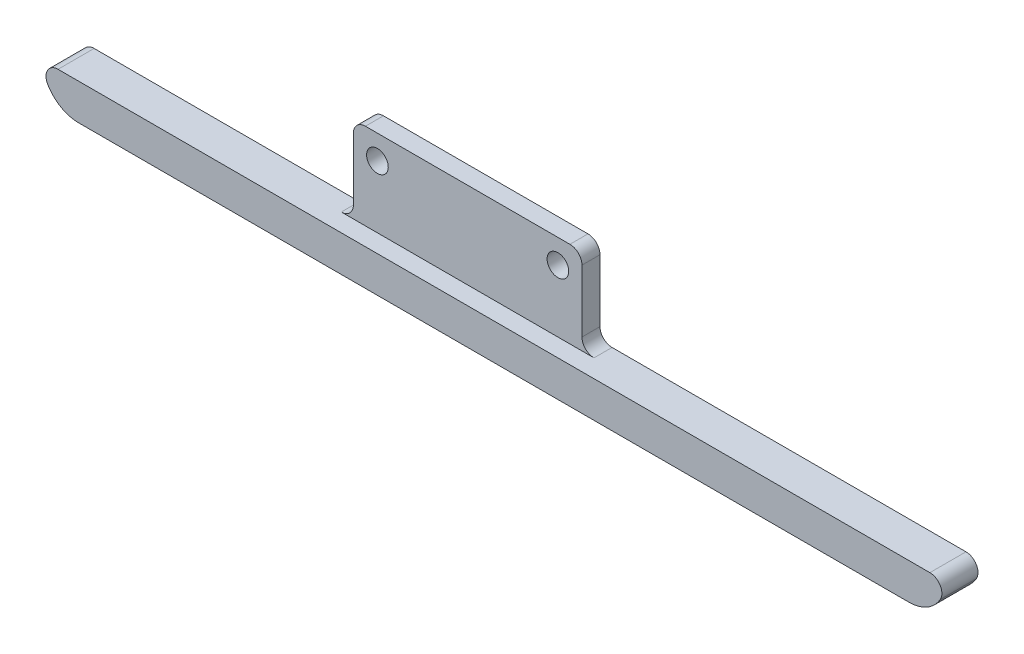
ISO-10303-21;
HEADER;
FILE_DESCRIPTION(('STEP AP214'),'2;1');
FILE_NAME('part.step','',(''),(''),'','','');
FILE_SCHEMA(('AUTOMOTIVE_DESIGN { 1 0 10303 214 1 1 1 1 }'));
ENDSEC;
DATA;
#1=APPLICATION_CONTEXT('core data for automotive mechanical design processes');
#2=APPLICATION_PROTOCOL_DEFINITION('international standard','automotive_design',2000,#1);
#3=PRODUCT_CONTEXT('',#1,'mechanical');
#4=PRODUCT('Part','Part','',(#3));
#5=PRODUCT_RELATED_PRODUCT_CATEGORY('part','',(#4));
#6=PRODUCT_DEFINITION_FORMATION('','',#4);
#7=PRODUCT_DEFINITION_CONTEXT('part definition',#1,'design');
#8=PRODUCT_DEFINITION('design','',#6,#7);
#9=PRODUCT_DEFINITION_SHAPE('','',#8);
#10=(LENGTH_UNIT() NAMED_UNIT(*) SI_UNIT(.MILLI.,.METRE.));
#11=(NAMED_UNIT(*) PLANE_ANGLE_UNIT() SI_UNIT($,.RADIAN.));
#12=(NAMED_UNIT(*) SI_UNIT($,.STERADIAN.) SOLID_ANGLE_UNIT());
#13=UNCERTAINTY_MEASURE_WITH_UNIT(LENGTH_MEASURE(1.E-05),#10,'distance_accuracy_value','');
#14=(GEOMETRIC_REPRESENTATION_CONTEXT(3) GLOBAL_UNCERTAINTY_ASSIGNED_CONTEXT((#13)) GLOBAL_UNIT_ASSIGNED_CONTEXT((#10,
#11,#12)) REPRESENTATION_CONTEXT('',''));
#15=CARTESIAN_POINT('',(0.,0.,0.));
#16=DIRECTION('',(0.,0.,1.));
#17=DIRECTION('',(1.,0.,0.));
#18=AXIS2_PLACEMENT_3D('',#15,#16,#17);
#19=CARTESIAN_POINT('',(0.,0.,6.));
#20=DIRECTION('',(0.,-1.,0.));
#21=DIRECTION('',(1.,0.,0.));
#22=AXIS2_PLACEMENT_3D('',#19,#20,#21);
#23=PLANE('',#22);
#24=DIRECTION('',(-1.,0.,0.));
#25=VECTOR('',#24,1.);
#26=CARTESIAN_POINT('',(0.,0.,0.));
#27=LINE('',#26,#25);
#28=CARTESIAN_POINT('',(144.,0.,0.));
#29=VERTEX_POINT('',#28);
#30=CARTESIAN_POINT('',(6.,0.,0.));
#31=VERTEX_POINT('',#30);
#32=EDGE_CURVE('E160',#29,#31,#27,.T.);
#33=ORIENTED_EDGE('',*,*,#32,.F.);
#34=DIRECTION('',(0.,0.,-1.));
#35=VECTOR('',#34,1.);
#36=CARTESIAN_POINT('',(144.,0.,6.));
#37=LINE('',#36,#35);
#38=CARTESIAN_POINT('',(144.,0.,6.));
#39=VERTEX_POINT('',#38);
#40=EDGE_CURVE('E172',#29,#39,#37,.F.);
#41=ORIENTED_EDGE('',*,*,#40,.T.);
#42=DIRECTION('',(-1.,0.,0.));
#43=VECTOR('',#42,1.);
#44=CARTESIAN_POINT('',(0.,0.,6.));
#45=LINE('',#44,#43);
#46=CARTESIAN_POINT('',(6.,0.,6.));
#47=VERTEX_POINT('',#46);
#48=EDGE_CURVE('E307',#39,#47,#45,.T.);
#49=ORIENTED_EDGE('',*,*,#48,.T.);
#50=DIRECTION('',(0.,0.,-1.));
#51=VECTOR('',#50,1.);
#52=CARTESIAN_POINT('',(6.,0.,6.));
#53=LINE('',#52,#51);
#54=EDGE_CURVE('E166',#47,#31,#53,.T.);
#55=ORIENTED_EDGE('',*,*,#54,.T.);
#56=EDGE_LOOP('',(#33,#41,#49,#55));
#57=FACE_BOUND('',#56,.T.);
#58=ADVANCED_FACE('F51',(#57),#23,.T.);
#59=CARTESIAN_POINT('',(0.,6.,6.));
#60=DIRECTION('',(0.,1.,0.));
#61=DIRECTION('',(0.,0.,1.));
#62=AXIS2_PLACEMENT_3D('',#59,#60,#61);
#63=PLANE('',#62);
#64=DIRECTION('',(1.,0.,0.));
#65=VECTOR('',#64,1.);
#66=CARTESIAN_POINT('',(0.,6.,6.));
#67=LINE('',#66,#65);
#68=CARTESIAN_POINT('',(2.53589838486225,6.,6.));
#69=VERTEX_POINT('',#68);
#70=CARTESIAN_POINT('',(147.464101615138,6.,6.));
#71=VERTEX_POINT('',#70);
#72=EDGE_CURVE('E310',#69,#71,#67,.T.);
#73=ORIENTED_EDGE('',*,*,#72,.T.);
#74=DIRECTION('',(0.,0.,-1.));
#75=VECTOR('',#74,1.);
#76=CARTESIAN_POINT('',(147.464101615138,6.,6.));
#77=LINE('',#76,#75);
#78=CARTESIAN_POINT('',(147.464101615138,6.,0.));
#79=VERTEX_POINT('',#78);
#80=EDGE_CURVE('E206',#71,#79,#77,.T.);
#81=ORIENTED_EDGE('',*,*,#80,.T.);
#82=DIRECTION('',(1.,0.,0.));
#83=VECTOR('',#82,1.);
#84=CARTESIAN_POINT('',(0.,6.,0.));
#85=LINE('',#84,#83);
#86=CARTESIAN_POINT('',(88.63,6.,0.));
#87=VERTEX_POINT('',#86);
#88=EDGE_CURVE('E176',#87,#79,#85,.T.);
#89=ORIENTED_EDGE('',*,*,#88,.F.);
#90=DIRECTION('',(0.,0.,-1.));
#91=VECTOR('',#90,1.);
#92=CARTESIAN_POINT('',(88.63,6.,3.));
#93=LINE('',#92,#91);
#94=CARTESIAN_POINT('',(88.63,6.,3.));
#95=VERTEX_POINT('',#94);
#96=EDGE_CURVE('E202',#87,#95,#93,.F.);
#97=ORIENTED_EDGE('',*,*,#96,.T.);
#98=DIRECTION('',(1.,0.,0.));
#99=VECTOR('',#98,1.);
#100=CARTESIAN_POINT('',(0.,6.,3.));
#101=LINE('',#100,#99);
#102=CARTESIAN_POINT('',(46.63,6.,3.));
#103=VERTEX_POINT('',#102);
#104=EDGE_CURVE('E177',#103,#95,#101,.T.);
#105=ORIENTED_EDGE('',*,*,#104,.F.);
#106=DIRECTION('',(0.,0.,-1.));
#107=VECTOR('',#106,1.);
#108=CARTESIAN_POINT('',(46.63,6.,0.));
#109=LINE('',#108,#107);
#110=CARTESIAN_POINT('',(46.63,6.,0.));
#111=VERTEX_POINT('',#110);
#112=EDGE_CURVE('E198',#103,#111,#109,.T.);
#113=ORIENTED_EDGE('',*,*,#112,.T.);
#114=CARTESIAN_POINT('',(2.53589838486225,6.,0.));
#115=VERTEX_POINT('',#114);
#116=EDGE_CURVE('E273',#115,#111,#85,.T.);
#117=ORIENTED_EDGE('',*,*,#116,.F.);
#118=DIRECTION('',(0.,0.,-1.));
#119=VECTOR('',#118,1.);
#120=CARTESIAN_POINT('',(2.53589838486225,6.,6.));
#121=LINE('',#120,#119);
#122=EDGE_CURVE('E195',#115,#69,#121,.F.);
#123=ORIENTED_EDGE('',*,*,#122,.T.);
#124=EDGE_LOOP('',(#73,#81,#89,#97,#105,#113,#117,#123));
#125=FACE_BOUND('',#124,.T.);
#126=ADVANCED_FACE('F326',(#125),#63,.T.);
#127=CARTESIAN_POINT('',(0.,0.,6.));
#128=DIRECTION('',(0.,0.,1.));
#129=DIRECTION('',(1.,0.,0.));
#130=AXIS2_PLACEMENT_3D('',#127,#128,#129);
#131=PLANE('',#130);
#132=CARTESIAN_POINT('',(144.,6.00000000000002,6.));
#133=DIRECTION('',(0.,0.,1.));
#134=DIRECTION('',(1.,0.,0.));
#135=AXIS2_PLACEMENT_3D('',#132,#133,#134);
#136=CIRCLE('',#135,6.);
#137=CARTESIAN_POINT('',(149.196152422707,3.,6.));
#138=VERTEX_POINT('',#137);
#139=EDGE_CURVE('E182',#39,#138,#136,.T.);
#140=ORIENTED_EDGE('',*,*,#139,.T.);
#141=CARTESIAN_POINT('',(147.464101615138,4.,6.));
#142=DIRECTION('',(0.,0.,1.));
#143=DIRECTION('',(1.,0.,0.));
#144=AXIS2_PLACEMENT_3D('',#141,#142,#143);
#145=CIRCLE('',#144,2.);
#146=EDGE_CURVE('E227',#138,#71,#145,.T.);
#147=ORIENTED_EDGE('',*,*,#146,.T.);
#148=ORIENTED_EDGE('',*,*,#72,.F.);
#149=CARTESIAN_POINT('',(2.53589838486225,4.,6.));
#150=DIRECTION('',(0.,0.,1.));
#151=DIRECTION('',(1.,0.,0.));
#152=AXIS2_PLACEMENT_3D('',#149,#150,#151);
#153=CIRCLE('',#152,2.);
#154=CARTESIAN_POINT('',(0.803847577293368,3.,6.));
#155=VERTEX_POINT('',#154);
#156=EDGE_CURVE('E224',#69,#155,#153,.T.);
#157=ORIENTED_EDGE('',*,*,#156,.T.);
#158=CARTESIAN_POINT('',(6.,6.,6.));
#159=DIRECTION('',(0.,0.,1.));
#160=DIRECTION('',(1.,0.,0.));
#161=AXIS2_PLACEMENT_3D('',#158,#159,#160);
#162=CIRCLE('',#161,6.);
#163=EDGE_CURVE('E184',#155,#47,#162,.T.);
#164=ORIENTED_EDGE('',*,*,#163,.T.);
#165=ORIENTED_EDGE('',*,*,#48,.F.);
#166=EDGE_LOOP('',(#140,#147,#148,#157,#164,#165));
#167=FACE_BOUND('',#166,.T.);
#168=ADVANCED_FACE('F329',(#167),#131,.T.);
#169=CARTESIAN_POINT('',(0.,0.,0.));
#170=DIRECTION('',(0.,0.,1.));
#171=DIRECTION('',(1.,0.,0.));
#172=AXIS2_PLACEMENT_3D('',#169,#170,#171);
#173=PLANE('',#172);
#174=CARTESIAN_POINT('',(52.63,16.35,0.));
#175=DIRECTION('',(0.,0.,1.));
#176=DIRECTION('',(1.,0.,0.));
#177=AXIS2_PLACEMENT_3D('',#174,#175,#176);
#178=CIRCLE('',#177,1.8);
#179=CARTESIAN_POINT('',(54.43,16.35,0.));
#180=VERTEX_POINT('',#179);
#181=EDGE_CURVE('E354',#180,#180,#178,.T.);
#182=ORIENTED_EDGE('',*,*,#181,.T.);
#183=EDGE_LOOP('',(#182));
#184=FACE_BOUND('',#183,.T.);
#185=CARTESIAN_POINT('',(82.63,16.35,0.));
#186=DIRECTION('',(0.,0.,1.));
#187=DIRECTION('',(1.,0.,0.));
#188=AXIS2_PLACEMENT_3D('',#185,#186,#187);
#189=CIRCLE('',#188,1.8);
#190=CARTESIAN_POINT('',(84.43,16.35,0.));
#191=VERTEX_POINT('',#190);
#192=EDGE_CURVE('E303',#191,#191,#189,.T.);
#193=ORIENTED_EDGE('',*,*,#192,.T.);
#194=EDGE_LOOP('',(#193));
#195=FACE_BOUND('',#194,.T.);
#196=ORIENTED_EDGE('',*,*,#88,.T.);
#197=CARTESIAN_POINT('',(147.464101615138,4.,0.));
#198=DIRECTION('',(0.,0.,1.));
#199=DIRECTION('',(1.,0.,0.));
#200=AXIS2_PLACEMENT_3D('',#197,#198,#199);
#201=CIRCLE('',#200,2.);
#202=CARTESIAN_POINT('',(149.196152422707,3.,0.));
#203=VERTEX_POINT('',#202);
#204=EDGE_CURVE('E161',#79,#203,#201,.F.);
#205=ORIENTED_EDGE('',*,*,#204,.T.);
#206=CARTESIAN_POINT('',(144.,6.00000000000002,0.));
#207=DIRECTION('',(0.,0.,1.));
#208=DIRECTION('',(1.,0.,0.));
#209=AXIS2_PLACEMENT_3D('',#206,#207,#208);
#210=CIRCLE('',#209,6.);
#211=EDGE_CURVE('E155',#203,#29,#210,.F.);
#212=ORIENTED_EDGE('',*,*,#211,.T.);
#213=ORIENTED_EDGE('',*,*,#32,.T.);
#214=CARTESIAN_POINT('',(6.,6.,0.));
#215=DIRECTION('',(0.,0.,1.));
#216=DIRECTION('',(1.,0.,0.));
#217=AXIS2_PLACEMENT_3D('',#214,#215,#216);
#218=CIRCLE('',#217,6.);
#219=CARTESIAN_POINT('',(0.803847577293368,3.,0.));
#220=VERTEX_POINT('',#219);
#221=EDGE_CURVE('E167',#31,#220,#218,.F.);
#222=ORIENTED_EDGE('',*,*,#221,.T.);
#223=CARTESIAN_POINT('',(2.53589838486225,4.,0.));
#224=DIRECTION('',(0.,0.,1.));
#225=DIRECTION('',(1.,0.,0.));
#226=AXIS2_PLACEMENT_3D('',#223,#224,#225);
#227=CIRCLE('',#226,2.);
#228=EDGE_CURVE('E210',#220,#115,#227,.F.);
#229=ORIENTED_EDGE('',*,*,#228,.T.);
#230=ORIENTED_EDGE('',*,*,#116,.T.);
#231=CARTESIAN_POINT('',(46.63,8.,0.));
#232=DIRECTION('',(0.,0.,1.));
#233=DIRECTION('',(1.,0.,0.));
#234=AXIS2_PLACEMENT_3D('',#231,#232,#233);
#235=CIRCLE('',#234,2.);
#236=CARTESIAN_POINT('',(48.63,8.,0.));
#237=VERTEX_POINT('',#236);
#238=EDGE_CURVE('E60',#111,#237,#235,.T.);
#239=ORIENTED_EDGE('',*,*,#238,.T.);
#240=DIRECTION('',(0.,1.,0.));
#241=VECTOR('',#240,1.);
#242=CARTESIAN_POINT('',(48.63,0.,0.));
#243=LINE('',#242,#241);
#244=CARTESIAN_POINT('',(48.63,18.35,0.));
#245=VERTEX_POINT('',#244);
#246=EDGE_CURVE('E271',#237,#245,#243,.T.);
#247=ORIENTED_EDGE('',*,*,#246,.T.);
#248=CARTESIAN_POINT('',(50.63,18.35,0.));
#249=DIRECTION('',(0.,0.,1.));
#250=DIRECTION('',(1.,0.,0.));
#251=AXIS2_PLACEMENT_3D('',#248,#249,#250);
#252=CIRCLE('',#251,2.);
#253=CARTESIAN_POINT('',(50.63,20.35,0.));
#254=VERTEX_POINT('',#253);
#255=EDGE_CURVE('E213',#245,#254,#252,.F.);
#256=ORIENTED_EDGE('',*,*,#255,.T.);
#257=DIRECTION('',(1.,0.,0.));
#258=VECTOR('',#257,1.);
#259=CARTESIAN_POINT('',(0.,20.35,0.));
#260=LINE('',#259,#258);
#261=CARTESIAN_POINT('',(84.63,20.35,0.));
#262=VERTEX_POINT('',#261);
#263=EDGE_CURVE('E283',#254,#262,#260,.T.);
#264=ORIENTED_EDGE('',*,*,#263,.T.);
#265=CARTESIAN_POINT('',(84.63,18.35,0.));
#266=DIRECTION('',(0.,0.,1.));
#267=DIRECTION('',(1.,0.,0.));
#268=AXIS2_PLACEMENT_3D('',#265,#266,#267);
#269=CIRCLE('',#268,2.);
#270=CARTESIAN_POINT('',(86.63,18.35,0.));
#271=VERTEX_POINT('',#270);
#272=EDGE_CURVE('E216',#262,#271,#269,.F.);
#273=ORIENTED_EDGE('',*,*,#272,.T.);
#274=DIRECTION('',(0.,-1.,0.));
#275=VECTOR('',#274,1.);
#276=CARTESIAN_POINT('',(86.63,0.,0.));
#277=LINE('',#276,#275);
#278=CARTESIAN_POINT('',(86.63,8.,0.));
#279=VERTEX_POINT('',#278);
#280=EDGE_CURVE('E299',#271,#279,#277,.T.);
#281=ORIENTED_EDGE('',*,*,#280,.T.);
#282=CARTESIAN_POINT('',(88.63,8.,0.));
#283=DIRECTION('',(0.,0.,1.));
#284=DIRECTION('',(1.,0.,0.));
#285=AXIS2_PLACEMENT_3D('',#282,#283,#284);
#286=CIRCLE('',#285,2.);
#287=EDGE_CURVE('E259',#279,#87,#286,.T.);
#288=ORIENTED_EDGE('',*,*,#287,.T.);
#289=EDGE_LOOP('',(#196,#205,#212,#213,#222,#229,#230,#239,#247,#256,#264,#273,#281,#288));
#290=FACE_BOUND('',#289,.T.);
#291=ADVANCED_FACE('F158',(#184,#195,#290),#173,.F.);
#292=CARTESIAN_POINT('',(86.63,0.,3.));
#293=DIRECTION('',(1.,0.,0.));
#294=DIRECTION('',(0.,0.,-1.));
#295=AXIS2_PLACEMENT_3D('',#292,#293,#294);
#296=PLANE('',#295);
#297=DIRECTION('',(0.,-1.,0.));
#298=VECTOR('',#297,1.);
#299=CARTESIAN_POINT('',(86.63,0.,3.));
#300=LINE('',#299,#298);
#301=CARTESIAN_POINT('',(86.63,18.35,3.));
#302=VERTEX_POINT('',#301);
#303=CARTESIAN_POINT('',(86.63,8.,3.));
#304=VERTEX_POINT('',#303);
#305=EDGE_CURVE('E282',#302,#304,#300,.T.);
#306=ORIENTED_EDGE('',*,*,#305,.T.);
#307=DIRECTION('',(0.,0.,-1.));
#308=VECTOR('',#307,1.);
#309=CARTESIAN_POINT('',(86.63,8.,0.));
#310=LINE('',#309,#308);
#311=EDGE_CURVE('E233',#304,#279,#310,.T.);
#312=ORIENTED_EDGE('',*,*,#311,.T.);
#313=ORIENTED_EDGE('',*,*,#280,.F.);
#314=DIRECTION('',(0.,0.,-1.));
#315=VECTOR('',#314,1.);
#316=CARTESIAN_POINT('',(86.63,18.35,3.));
#317=LINE('',#316,#315);
#318=EDGE_CURVE('E230',#271,#302,#317,.F.);
#319=ORIENTED_EDGE('',*,*,#318,.T.);
#320=EDGE_LOOP('',(#306,#312,#313,#319));
#321=FACE_BOUND('',#320,.T.);
#322=ADVANCED_FACE('F342',(#321),#296,.T.);
#323=CARTESIAN_POINT('',(0.,20.35,3.));
#324=DIRECTION('',(0.,1.,0.));
#325=DIRECTION('',(0.,0.,1.));
#326=AXIS2_PLACEMENT_3D('',#323,#324,#325);
#327=PLANE('',#326);
#328=DIRECTION('',(1.,0.,0.));
#329=VECTOR('',#328,1.);
#330=CARTESIAN_POINT('',(0.,20.35,3.));
#331=LINE('',#330,#329);
#332=CARTESIAN_POINT('',(50.63,20.35,3.));
#333=VERTEX_POINT('',#332);
#334=CARTESIAN_POINT('',(84.63,20.35,3.));
#335=VERTEX_POINT('',#334);
#336=EDGE_CURVE('E291',#333,#335,#331,.T.);
#337=ORIENTED_EDGE('',*,*,#336,.T.);
#338=DIRECTION('',(0.,0.,-1.));
#339=VECTOR('',#338,1.);
#340=CARTESIAN_POINT('',(84.63,20.35,3.));
#341=LINE('',#340,#339);
#342=EDGE_CURVE('E246',#335,#262,#341,.T.);
#343=ORIENTED_EDGE('',*,*,#342,.T.);
#344=ORIENTED_EDGE('',*,*,#263,.F.);
#345=DIRECTION('',(0.,0.,-1.));
#346=VECTOR('',#345,1.);
#347=CARTESIAN_POINT('',(50.63,20.35,3.));
#348=LINE('',#347,#346);
#349=EDGE_CURVE('E74',#254,#333,#348,.F.);
#350=ORIENTED_EDGE('',*,*,#349,.T.);
#351=EDGE_LOOP('',(#337,#343,#344,#350));
#352=FACE_BOUND('',#351,.T.);
#353=ADVANCED_FACE('F405',(#352),#327,.T.);
#354=CARTESIAN_POINT('',(48.63,0.,3.));
#355=DIRECTION('',(-1.,0.,0.));
#356=DIRECTION('',(0.,0.,1.));
#357=AXIS2_PLACEMENT_3D('',#354,#355,#356);
#358=PLANE('',#357);
#359=ORIENTED_EDGE('',*,*,#246,.F.);
#360=DIRECTION('',(0.,0.,-1.));
#361=VECTOR('',#360,1.);
#362=CARTESIAN_POINT('',(48.63,8.,3.));
#363=LINE('',#362,#361);
#364=CARTESIAN_POINT('',(48.63,8.,3.));
#365=VERTEX_POINT('',#364);
#366=EDGE_CURVE('E241',#237,#365,#363,.F.);
#367=ORIENTED_EDGE('',*,*,#366,.T.);
#368=DIRECTION('',(0.,1.,0.));
#369=VECTOR('',#368,1.);
#370=CARTESIAN_POINT('',(48.63,0.,3.));
#371=LINE('',#370,#369);
#372=CARTESIAN_POINT('',(48.63,18.35,3.));
#373=VERTEX_POINT('',#372);
#374=EDGE_CURVE('E288',#365,#373,#371,.T.);
#375=ORIENTED_EDGE('',*,*,#374,.T.);
#376=DIRECTION('',(0.,0.,-1.));
#377=VECTOR('',#376,1.);
#378=CARTESIAN_POINT('',(48.63,18.35,3.));
#379=LINE('',#378,#377);
#380=EDGE_CURVE('E237',#373,#245,#379,.T.);
#381=ORIENTED_EDGE('',*,*,#380,.T.);
#382=EDGE_LOOP('',(#359,#367,#375,#381));
#383=FACE_BOUND('',#382,.T.);
#384=ADVANCED_FACE('F278',(#383),#358,.T.);
#385=CARTESIAN_POINT('',(0.,0.,3.));
#386=DIRECTION('',(0.,0.,1.));
#387=DIRECTION('',(1.,0.,0.));
#388=AXIS2_PLACEMENT_3D('',#385,#386,#387);
#389=PLANE('',#388);
#390=CARTESIAN_POINT('',(52.63,16.35,3.));
#391=DIRECTION('',(0.,0.,1.));
#392=DIRECTION('',(1.,0.,0.));
#393=AXIS2_PLACEMENT_3D('',#390,#391,#392);
#394=CIRCLE('',#393,1.79999999999999);
#395=CARTESIAN_POINT('',(54.43,16.35,3.));
#396=VERTEX_POINT('',#395);
#397=EDGE_CURVE('E358',#396,#396,#394,.T.);
#398=ORIENTED_EDGE('',*,*,#397,.F.);
#399=EDGE_LOOP('',(#398));
#400=FACE_BOUND('',#399,.T.);
#401=CARTESIAN_POINT('',(82.63,16.35,3.));
#402=DIRECTION('',(0.,0.,1.));
#403=DIRECTION('',(1.,0.,0.));
#404=AXIS2_PLACEMENT_3D('',#401,#402,#403);
#405=CIRCLE('',#404,1.79999999999998);
#406=CARTESIAN_POINT('',(84.43,16.35,3.));
#407=VERTEX_POINT('',#406);
#408=EDGE_CURVE('E350',#407,#407,#405,.T.);
#409=ORIENTED_EDGE('',*,*,#408,.F.);
#410=EDGE_LOOP('',(#409));
#411=FACE_BOUND('',#410,.T.);
#412=ORIENTED_EDGE('',*,*,#305,.F.);
#413=CARTESIAN_POINT('',(84.63,18.35,3.));
#414=DIRECTION('',(0.,0.,1.));
#415=DIRECTION('',(1.,0.,0.));
#416=AXIS2_PLACEMENT_3D('',#413,#414,#415);
#417=CIRCLE('',#416,2.);
#418=EDGE_CURVE('E67',#302,#335,#417,.T.);
#419=ORIENTED_EDGE('',*,*,#418,.T.);
#420=ORIENTED_EDGE('',*,*,#336,.F.);
#421=CARTESIAN_POINT('',(50.63,18.35,3.));
#422=DIRECTION('',(0.,0.,1.));
#423=DIRECTION('',(1.,0.,0.));
#424=AXIS2_PLACEMENT_3D('',#421,#422,#423);
#425=CIRCLE('',#424,2.);
#426=EDGE_CURVE('E250',#333,#373,#425,.T.);
#427=ORIENTED_EDGE('',*,*,#426,.T.);
#428=ORIENTED_EDGE('',*,*,#374,.F.);
#429=CARTESIAN_POINT('',(46.63,8.,3.));
#430=DIRECTION('',(0.,0.,1.));
#431=DIRECTION('',(1.,0.,0.));
#432=AXIS2_PLACEMENT_3D('',#429,#430,#431);
#433=CIRCLE('',#432,2.);
#434=EDGE_CURVE('E11',#365,#103,#433,.F.);
#435=ORIENTED_EDGE('',*,*,#434,.T.);
#436=ORIENTED_EDGE('',*,*,#104,.T.);
#437=CARTESIAN_POINT('',(88.63,8.,3.));
#438=DIRECTION('',(0.,0.,1.));
#439=DIRECTION('',(1.,0.,0.));
#440=AXIS2_PLACEMENT_3D('',#437,#438,#439);
#441=CIRCLE('',#440,2.);
#442=EDGE_CURVE('E262',#95,#304,#441,.F.);
#443=ORIENTED_EDGE('',*,*,#442,.T.);
#444=EDGE_LOOP('',(#412,#419,#420,#427,#428,#435,#436,#443));
#445=FACE_BOUND('',#444,.T.);
#446=ADVANCED_FACE('F287',(#400,#411,#445),#389,.T.);
#447=CARTESIAN_POINT('',(82.63,16.35,3.));
#448=DIRECTION('',(0.,0.,1.));
#449=DIRECTION('',(1.,0.,0.));
#450=AXIS2_PLACEMENT_3D('',#447,#448,#449);
#451=CYLINDRICAL_SURFACE('',#450,1.79999999999999);
#452=ORIENTED_EDGE('',*,*,#192,.F.);
#453=EDGE_LOOP('',(#452));
#454=FACE_BOUND('',#453,.T.);
#455=ORIENTED_EDGE('',*,*,#408,.T.);
#456=EDGE_LOOP('',(#455));
#457=FACE_BOUND('',#456,.T.);
#458=ADVANCED_FACE('F368',(#454,#457),#451,.F.);
#459=CARTESIAN_POINT('',(52.63,16.35,3.));
#460=DIRECTION('',(0.,0.,1.));
#461=DIRECTION('',(1.,0.,0.));
#462=AXIS2_PLACEMENT_3D('',#459,#460,#461);
#463=CYLINDRICAL_SURFACE('',#462,1.79999999999999);
#464=ORIENTED_EDGE('',*,*,#181,.F.);
#465=EDGE_LOOP('',(#464));
#466=FACE_BOUND('',#465,.T.);
#467=ORIENTED_EDGE('',*,*,#397,.T.);
#468=EDGE_LOOP('',(#467));
#469=FACE_BOUND('',#468,.T.);
#470=ADVANCED_FACE('F364',(#466,#469),#463,.F.);
#471=CARTESIAN_POINT('',(144.,6.00000000000002,6.));
#472=DIRECTION('',(0.,0.,-1.));
#473=DIRECTION('',(-1.,0.,0.));
#474=AXIS2_PLACEMENT_3D('',#471,#472,#473);
#475=CYLINDRICAL_SURFACE('',#474,6.);
#476=ORIENTED_EDGE('',*,*,#211,.F.);
#477=DIRECTION('',(0.,0.,-1.));
#478=VECTOR('',#477,1.);
#479=CARTESIAN_POINT('',(149.196152422707,3.,6.));
#480=LINE('',#479,#478);
#481=EDGE_CURVE('E221',#203,#138,#480,.F.);
#482=ORIENTED_EDGE('',*,*,#481,.T.);
#483=ORIENTED_EDGE('',*,*,#139,.F.);
#484=ORIENTED_EDGE('',*,*,#40,.F.);
#485=EDGE_LOOP('',(#476,#482,#483,#484));
#486=FACE_BOUND('',#485,.T.);
#487=ADVANCED_FACE('F180',(#486),#475,.T.);
#488=CARTESIAN_POINT('',(6.,6.,6.));
#489=DIRECTION('',(0.,0.,-1.));
#490=DIRECTION('',(-1.,0.,0.));
#491=AXIS2_PLACEMENT_3D('',#488,#489,#490);
#492=CYLINDRICAL_SURFACE('',#491,6.);
#493=ORIENTED_EDGE('',*,*,#163,.F.);
#494=DIRECTION('',(0.,0.,-1.));
#495=VECTOR('',#494,1.);
#496=CARTESIAN_POINT('',(0.803847577293368,3.,6.));
#497=LINE('',#496,#495);
#498=EDGE_CURVE('E255',#155,#220,#497,.T.);
#499=ORIENTED_EDGE('',*,*,#498,.T.);
#500=ORIENTED_EDGE('',*,*,#221,.F.);
#501=ORIENTED_EDGE('',*,*,#54,.F.);
#502=EDGE_LOOP('',(#493,#499,#500,#501));
#503=FACE_BOUND('',#502,.T.);
#504=ADVANCED_FACE('F319',(#503),#492,.T.);
#505=CARTESIAN_POINT('',(147.464101615138,4.,6.));
#506=DIRECTION('',(0.,0.,-1.));
#507=DIRECTION('',(-1.,0.,0.));
#508=AXIS2_PLACEMENT_3D('',#505,#506,#507);
#509=CYLINDRICAL_SURFACE('',#508,2.);
#510=ORIENTED_EDGE('',*,*,#146,.F.);
#511=ORIENTED_EDGE('',*,*,#481,.F.);
#512=ORIENTED_EDGE('',*,*,#204,.F.);
#513=ORIENTED_EDGE('',*,*,#80,.F.);
#514=EDGE_LOOP('',(#510,#511,#512,#513));
#515=FACE_BOUND('',#514,.T.);
#516=ADVANCED_FACE('F332',(#515),#509,.T.);
#517=CARTESIAN_POINT('',(88.63,8.,3.));
#518=DIRECTION('',(0.,0.,1.));
#519=DIRECTION('',(1.,0.,0.));
#520=AXIS2_PLACEMENT_3D('',#517,#518,#519);
#521=CYLINDRICAL_SURFACE('',#520,2.);
#522=ORIENTED_EDGE('',*,*,#442,.F.);
#523=ORIENTED_EDGE('',*,*,#96,.F.);
#524=ORIENTED_EDGE('',*,*,#287,.F.);
#525=ORIENTED_EDGE('',*,*,#311,.F.);
#526=EDGE_LOOP('',(#522,#523,#524,#525));
#527=FACE_BOUND('',#526,.T.);
#528=ADVANCED_FACE('F339',(#527),#521,.F.);
#529=CARTESIAN_POINT('',(46.63,8.,6.));
#530=DIRECTION('',(0.,0.,1.));
#531=DIRECTION('',(1.,0.,0.));
#532=AXIS2_PLACEMENT_3D('',#529,#530,#531);
#533=CYLINDRICAL_SURFACE('',#532,2.);
#534=ORIENTED_EDGE('',*,*,#434,.F.);
#535=ORIENTED_EDGE('',*,*,#366,.F.);
#536=ORIENTED_EDGE('',*,*,#238,.F.);
#537=ORIENTED_EDGE('',*,*,#112,.F.);
#538=EDGE_LOOP('',(#534,#535,#536,#537));
#539=FACE_BOUND('',#538,.T.);
#540=ADVANCED_FACE('F286',(#539),#533,.F.);
#541=CARTESIAN_POINT('',(84.63,18.35,3.));
#542=DIRECTION('',(0.,0.,-1.));
#543=DIRECTION('',(-1.,0.,0.));
#544=AXIS2_PLACEMENT_3D('',#541,#542,#543);
#545=CYLINDRICAL_SURFACE('',#544,2.);
#546=ORIENTED_EDGE('',*,*,#418,.F.);
#547=ORIENTED_EDGE('',*,*,#318,.F.);
#548=ORIENTED_EDGE('',*,*,#272,.F.);
#549=ORIENTED_EDGE('',*,*,#342,.F.);
#550=EDGE_LOOP('',(#546,#547,#548,#549));
#551=FACE_BOUND('',#550,.T.);
#552=ADVANCED_FACE('F397',(#551),#545,.T.);
#553=CARTESIAN_POINT('',(50.63,18.35,3.));
#554=DIRECTION('',(0.,0.,-1.));
#555=DIRECTION('',(-1.,0.,0.));
#556=AXIS2_PLACEMENT_3D('',#553,#554,#555);
#557=CYLINDRICAL_SURFACE('',#556,2.);
#558=ORIENTED_EDGE('',*,*,#426,.F.);
#559=ORIENTED_EDGE('',*,*,#349,.F.);
#560=ORIENTED_EDGE('',*,*,#255,.F.);
#561=ORIENTED_EDGE('',*,*,#380,.F.);
#562=EDGE_LOOP('',(#558,#559,#560,#561));
#563=FACE_BOUND('',#562,.T.);
#564=ADVANCED_FACE('F399',(#563),#557,.T.);
#565=CARTESIAN_POINT('',(2.53589838486225,4.,6.));
#566=DIRECTION('',(0.,0.,-1.));
#567=DIRECTION('',(-1.,0.,0.));
#568=AXIS2_PLACEMENT_3D('',#565,#566,#567);
#569=CYLINDRICAL_SURFACE('',#568,2.);
#570=ORIENTED_EDGE('',*,*,#156,.F.);
#571=ORIENTED_EDGE('',*,*,#122,.F.);
#572=ORIENTED_EDGE('',*,*,#228,.F.);
#573=ORIENTED_EDGE('',*,*,#498,.F.);
#574=EDGE_LOOP('',(#570,#571,#572,#573));
#575=FACE_BOUND('',#574,.T.);
#576=ADVANCED_FACE('F53',(#575),#569,.T.);
#577=CLOSED_SHELL('',(#58,#126,#168,#291,#322,#353,#384,#446,#458,#470,#487,#504,#516,#528,#540,
#552,#564,#576));
#578=MANIFOLD_SOLID_BREP('B2',#577);
#579=ADVANCED_BREP_SHAPE_REPRESENTATION('',(#18,#578),#14);
#580=SHAPE_DEFINITION_REPRESENTATION(#9,#579);
ENDSEC;
END-ISO-10303-21;
